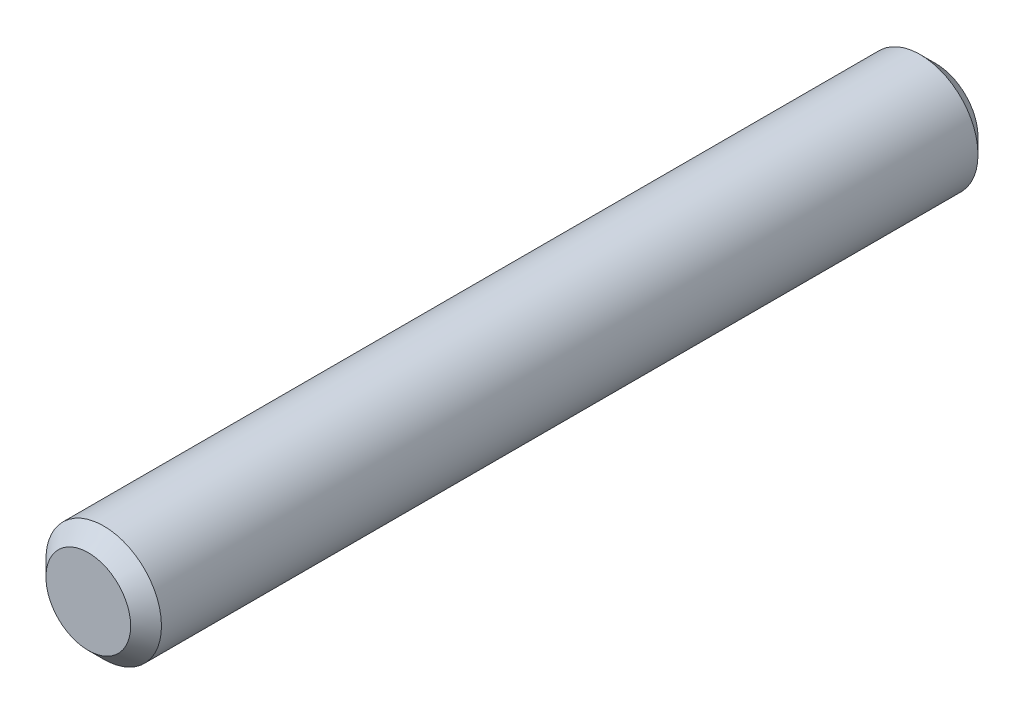
ISO-10303-21;
HEADER;
FILE_DESCRIPTION(('STEP AP214'),'2;1');
FILE_NAME('part.step','',(''),(''),'','','');
FILE_SCHEMA(('AUTOMOTIVE_DESIGN { 1 0 10303 214 1 1 1 1 }'));
ENDSEC;
DATA;
#1=APPLICATION_CONTEXT('core data for automotive mechanical design processes');
#2=APPLICATION_PROTOCOL_DEFINITION('international standard','automotive_design',2000,#1);
#3=PRODUCT_CONTEXT('',#1,'mechanical');
#4=PRODUCT('Part','Part','',(#3));
#5=PRODUCT_RELATED_PRODUCT_CATEGORY('part','',(#4));
#6=PRODUCT_DEFINITION_FORMATION('','',#4);
#7=PRODUCT_DEFINITION_CONTEXT('part definition',#1,'design');
#8=PRODUCT_DEFINITION('design','',#6,#7);
#9=PRODUCT_DEFINITION_SHAPE('','',#8);
#10=(LENGTH_UNIT() NAMED_UNIT(*) SI_UNIT(.MILLI.,.METRE.));
#11=(NAMED_UNIT(*) PLANE_ANGLE_UNIT() SI_UNIT($,.RADIAN.));
#12=(NAMED_UNIT(*) SI_UNIT($,.STERADIAN.) SOLID_ANGLE_UNIT());
#13=UNCERTAINTY_MEASURE_WITH_UNIT(LENGTH_MEASURE(1.E-05),#10,'distance_accuracy_value','');
#14=(GEOMETRIC_REPRESENTATION_CONTEXT(3) GLOBAL_UNCERTAINTY_ASSIGNED_CONTEXT((#13)) GLOBAL_UNIT_ASSIGNED_CONTEXT((#10,
#11,#12)) REPRESENTATION_CONTEXT('',''));
#15=CARTESIAN_POINT('',(0.,0.,0.));
#16=DIRECTION('',(0.,0.,1.));
#17=DIRECTION('',(1.,0.,0.));
#18=AXIS2_PLACEMENT_3D('',#15,#16,#17);
#19=CARTESIAN_POINT('',(0.,0.,110.));
#20=DIRECTION('',(0.,0.,-1.));
#21=DIRECTION('',(-1.,0.,0.));
#22=AXIS2_PLACEMENT_3D('',#19,#20,#21);
#23=CYLINDRICAL_SURFACE('',#22,7.5);
#24=CARTESIAN_POINT('',(0.,0.,108.));
#25=DIRECTION('',(0.,0.,1.));
#26=DIRECTION('',(1.,0.,0.));
#27=AXIS2_PLACEMENT_3D('',#24,#25,#26);
#28=CIRCLE('',#27,7.5);
#29=CARTESIAN_POINT('',(7.5,0.,108.));
#30=VERTEX_POINT('',#29);
#31=EDGE_CURVE('E48',#30,#30,#28,.F.);
#32=ORIENTED_EDGE('',*,*,#31,.T.);
#33=EDGE_LOOP('',(#32));
#34=FACE_BOUND('',#33,.T.);
#35=CARTESIAN_POINT('',(0.,0.,2.));
#36=DIRECTION('',(0.,0.,1.));
#37=DIRECTION('',(1.,0.,0.));
#38=AXIS2_PLACEMENT_3D('',#35,#36,#37);
#39=CIRCLE('',#38,7.5);
#40=CARTESIAN_POINT('',(7.5,0.,2.));
#41=VERTEX_POINT('',#40);
#42=EDGE_CURVE('E53',#41,#41,#39,.T.);
#43=ORIENTED_EDGE('',*,*,#42,.T.);
#44=EDGE_LOOP('',(#43));
#45=FACE_BOUND('',#44,.T.);
#46=ADVANCED_FACE('F39',(#34,#45),#23,.T.);
#47=CARTESIAN_POINT('',(0.,0.,110.));
#48=DIRECTION('',(0.,0.,1.));
#49=DIRECTION('',(1.,0.,0.));
#50=AXIS2_PLACEMENT_3D('',#47,#48,#49);
#51=PLANE('',#50);
#52=CARTESIAN_POINT('',(0.,0.,110.));
#53=DIRECTION('',(0.,0.,1.));
#54=DIRECTION('',(1.,0.,0.));
#55=AXIS2_PLACEMENT_3D('',#52,#53,#54);
#56=CIRCLE('',#55,5.49999999999999);
#57=CARTESIAN_POINT('',(5.49999999999999,0.,110.));
#58=VERTEX_POINT('',#57);
#59=EDGE_CURVE('E58',#58,#58,#56,.T.);
#60=ORIENTED_EDGE('',*,*,#59,.T.);
#61=EDGE_LOOP('',(#60));
#62=FACE_BOUND('',#61,.T.);
#63=ADVANCED_FACE('F65',(#62),#51,.T.);
#64=CARTESIAN_POINT('',(0.,0.,0.));
#65=DIRECTION('',(0.,0.,1.));
#66=DIRECTION('',(1.,0.,0.));
#67=AXIS2_PLACEMENT_3D('',#64,#65,#66);
#68=PLANE('',#67);
#69=CARTESIAN_POINT('',(0.,0.,0.));
#70=DIRECTION('',(0.,0.,1.));
#71=DIRECTION('',(1.,0.,0.));
#72=AXIS2_PLACEMENT_3D('',#69,#70,#71);
#73=CIRCLE('',#72,5.49999999999999);
#74=CARTESIAN_POINT('',(5.49999999999999,0.,0.));
#75=VERTEX_POINT('',#74);
#76=EDGE_CURVE('E10',#75,#75,#73,.F.);
#77=ORIENTED_EDGE('',*,*,#76,.T.);
#78=EDGE_LOOP('',(#77));
#79=FACE_BOUND('',#78,.T.);
#80=ADVANCED_FACE('F69',(#79),#68,.F.);
#81=CARTESIAN_POINT('',(0.,0.,110.));
#82=DIRECTION('',(0.,0.,-1.));
#83=DIRECTION('',(-1.,0.,0.));
#84=AXIS2_PLACEMENT_3D('',#81,#82,#83);
#85=CONICAL_SURFACE('',#84,5.49999999999999,0.78539816339745);
#86=ORIENTED_EDGE('',*,*,#31,.F.);
#87=EDGE_LOOP('',(#86));
#88=FACE_BOUND('',#87,.T.);
#89=ORIENTED_EDGE('',*,*,#59,.F.);
#90=EDGE_LOOP('',(#89));
#91=FACE_BOUND('',#90,.T.);
#92=ADVANCED_FACE('F67',(#88,#91),#85,.T.);
#93=CARTESIAN_POINT('',(0.,0.,2.));
#94=DIRECTION('',(0.,0.,1.));
#95=DIRECTION('',(1.,0.,0.));
#96=AXIS2_PLACEMENT_3D('',#93,#94,#95);
#97=CONICAL_SURFACE('',#96,7.5,0.78539816339745);
#98=ORIENTED_EDGE('',*,*,#76,.F.);
#99=EDGE_LOOP('',(#98));
#100=FACE_BOUND('',#99,.T.);
#101=ORIENTED_EDGE('',*,*,#42,.F.);
#102=EDGE_LOOP('',(#101));
#103=FACE_BOUND('',#102,.T.);
#104=ADVANCED_FACE('F42',(#100,#103),#97,.T.);
#105=CLOSED_SHELL('',(#46,#63,#80,#92,#104));
#106=MANIFOLD_SOLID_BREP('B2',#105);
#107=ADVANCED_BREP_SHAPE_REPRESENTATION('',(#18,#106),#14);
#108=SHAPE_DEFINITION_REPRESENTATION(#9,#107);
ENDSEC;
END-ISO-10303-21;
